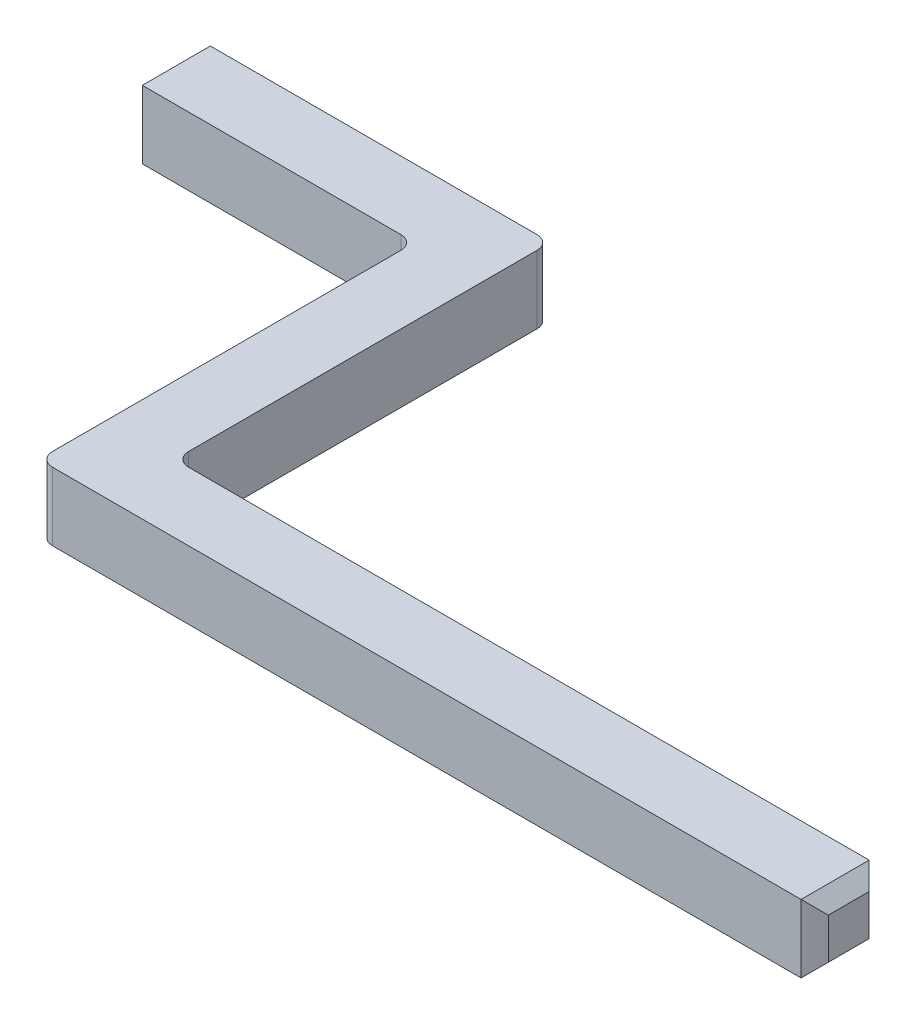
ISO-10303-21;
HEADER;
FILE_DESCRIPTION(('STEP AP214'),'2;1');
FILE_NAME('part.step','',(''),(''),'','','');
FILE_SCHEMA(('AUTOMOTIVE_DESIGN { 1 0 10303 214 1 1 1 1 }'));
ENDSEC;
DATA;
#1=APPLICATION_CONTEXT('core data for automotive mechanical design processes');
#2=APPLICATION_PROTOCOL_DEFINITION('international standard','automotive_design',2000,#1);
#3=PRODUCT_CONTEXT('',#1,'mechanical');
#4=PRODUCT('Part','Part','',(#3));
#5=PRODUCT_RELATED_PRODUCT_CATEGORY('part','',(#4));
#6=PRODUCT_DEFINITION_FORMATION('','',#4);
#7=PRODUCT_DEFINITION_CONTEXT('part definition',#1,'design');
#8=PRODUCT_DEFINITION('design','',#6,#7);
#9=PRODUCT_DEFINITION_SHAPE('','',#8);
#10=(LENGTH_UNIT() NAMED_UNIT(*) SI_UNIT(.MILLI.,.METRE.));
#11=(NAMED_UNIT(*) PLANE_ANGLE_UNIT() SI_UNIT($,.RADIAN.));
#12=(NAMED_UNIT(*) SI_UNIT($,.STERADIAN.) SOLID_ANGLE_UNIT());
#13=UNCERTAINTY_MEASURE_WITH_UNIT(LENGTH_MEASURE(1.E-05),#10,'distance_accuracy_value','');
#14=(GEOMETRIC_REPRESENTATION_CONTEXT(3) GLOBAL_UNCERTAINTY_ASSIGNED_CONTEXT((#13)) GLOBAL_UNIT_ASSIGNED_CONTEXT((#10,
#11,#12)) REPRESENTATION_CONTEXT('',''));
#15=CARTESIAN_POINT('',(0.,0.,0.));
#16=DIRECTION('',(0.,0.,1.));
#17=DIRECTION('',(1.,0.,0.));
#18=AXIS2_PLACEMENT_3D('',#15,#16,#17);
#19=CARTESIAN_POINT('',(-11.131176343569,-0.780745539294026,1.66999948918819));
#20=DIRECTION('',(0.,-1.,0.));
#21=DIRECTION('',(0.,0.,-1.));
#22=AXIS2_PLACEMENT_3D('',#19,#20,#21);
#23=PLANE('',#22);
#24=CARTESIAN_POINT('',(-12.8311756759867,-0.780745539294026,3.19999957084655));
#25=DIRECTION('',(0.,1.,0.));
#26=DIRECTION('',(-1.43052306964333E-05,0.,0.99999999989768));
#27=AXIS2_PLACEMENT_3D('',#24,#25,#26);
#28=CIRCLE('',#27,0.0999999046428003);
#29=CARTESIAN_POINT('',(-12.9311755806295,-0.780745539294026,3.19999957084655));
#30=VERTEX_POINT('',#29);
#31=CARTESIAN_POINT('',(-12.8311771065084,-0.780745539294026,3.29999947547912));
#32=VERTEX_POINT('',#31);
#33=EDGE_CURVE('E11',#30,#32,#28,.T.);
#34=ORIENTED_EDGE('',*,*,#33,.T.);
#35=DIRECTION('',(1.,0.,0.));
#36=VECTOR('',#35,1.);
#37=CARTESIAN_POINT('',(-12.8311771065084,-0.780745539294026,3.29999947547912));
#38=LINE('',#37,#36);
#39=CARTESIAN_POINT('',(-7.33117710650841,-0.780745539294026,3.29999947547912));
#40=VERTEX_POINT('',#39);
#41=EDGE_CURVE('E223',#32,#40,#38,.T.);
#42=ORIENTED_EDGE('',*,*,#41,.T.);
#43=DIRECTION('',(0.,0.,-1.));
#44=VECTOR('',#43,1.);
#45=CARTESIAN_POINT('',(-7.33117710650841,-0.780745539294026,3.29999947547912));
#46=LINE('',#45,#44);
#47=CARTESIAN_POINT('',(-7.33117710650841,-0.780745539294026,2.79999947547912));
#48=VERTEX_POINT('',#47);
#49=EDGE_CURVE('E167',#40,#48,#46,.T.);
#50=ORIENTED_EDGE('',*,*,#49,.T.);
#51=DIRECTION('',(-1.,0.,0.));
#52=VECTOR('',#51,1.);
#53=CARTESIAN_POINT('',(-7.33117710650841,-0.780745539294026,2.79999947547912));
#54=LINE('',#53,#52);
#55=CARTESIAN_POINT('',(-12.3311771065084,-0.780745539294026,2.79999947547912));
#56=VERTEX_POINT('',#55);
#57=EDGE_CURVE('E160',#48,#56,#54,.T.);
#58=ORIENTED_EDGE('',*,*,#57,.T.);
#59=CARTESIAN_POINT('',(-12.3311756759593,-0.780745539294026,2.69999957081912));
#60=DIRECTION('',(0.,-1.,0.));
#61=DIRECTION('',(-1.4305505051084E-05,0.,0.999999999897676));
#62=AXIS2_PLACEMENT_3D('',#59,#60,#61);
#63=CIRCLE('',#62,0.0999999046702354);
#64=CARTESIAN_POINT('',(-12.4311755806295,-0.780745539294026,2.69999957084656));
#65=VERTEX_POINT('',#64);
#66=EDGE_CURVE('E164',#56,#65,#63,.T.);
#67=ORIENTED_EDGE('',*,*,#66,.T.);
#68=DIRECTION('',(-2.74346505433993E-10,0.,-1.));
#69=VECTOR('',#68,1.);
#70=CARTESIAN_POINT('',(-12.4311755806295,-0.780745539294026,2.69999957084656));
#71=LINE('',#70,#69);
#72=CARTESIAN_POINT('',(-12.4311755813318,-0.780745539294026,0.13999945614908));
#73=VERTEX_POINT('',#72);
#74=EDGE_CURVE('E212',#65,#73,#71,.T.);
#75=ORIENTED_EDGE('',*,*,#74,.T.);
#76=CARTESIAN_POINT('',(-12.5311778694479,-0.780745539294026,0.140001791040547));
#77=DIRECTION('',(0.,1.,0.));
#78=DIRECTION('',(0.,0.,-1.));
#79=AXIS2_PLACEMENT_3D('',#76,#77,#78);
#80=CIRCLE('',#79,0.10000228814329);
#81=CARTESIAN_POINT('',(-12.5311778694479,-0.780745539294026,0.0399995028972566));
#82=VERTEX_POINT('',#81);
#83=EDGE_CURVE('E199',#73,#82,#80,.T.);
#84=ORIENTED_EDGE('',*,*,#83,.T.);
#85=DIRECTION('',(-1.,0.,0.));
#86=VECTOR('',#85,1.);
#87=CARTESIAN_POINT('',(-12.5311778694479,-0.780745539294026,0.0399995028972566));
#88=LINE('',#87,#86);
#89=CARTESIAN_POINT('',(-14.9311755806295,-0.780745539294026,0.0399995028972566));
#90=VERTEX_POINT('',#89);
#91=EDGE_CURVE('E269',#82,#90,#88,.T.);
#92=ORIENTED_EDGE('',*,*,#91,.T.);
#93=DIRECTION('',(0.,0.,1.));
#94=VECTOR('',#93,1.);
#95=CARTESIAN_POINT('',(-14.9311755806295,-0.780745539294026,0.0399995028972566));
#96=LINE('',#95,#94);
#97=CARTESIAN_POINT('',(-14.9311755806295,-0.780745539294026,0.539999485015865));
#98=VERTEX_POINT('',#97);
#99=EDGE_CURVE('E244',#90,#98,#96,.T.);
#100=ORIENTED_EDGE('',*,*,#99,.T.);
#101=DIRECTION('',(1.,0.,0.));
#102=VECTOR('',#101,1.);
#103=CARTESIAN_POINT('',(-14.9311755806295,-0.780745539294026,0.539999485015865));
#104=LINE('',#103,#102);
#105=CARTESIAN_POINT('',(-13.0311778694479,-0.780745539294026,0.539999485015865));
#106=VERTEX_POINT('',#105);
#107=EDGE_CURVE('E273',#98,#106,#104,.T.);
#108=ORIENTED_EDGE('',*,*,#107,.T.);
#109=CARTESIAN_POINT('',(-13.0311778694479,-0.780745539294026,0.640001773859875));
#110=DIRECTION('',(0.,-1.,0.));
#111=DIRECTION('',(0.,0.,-1.));
#112=AXIS2_PLACEMENT_3D('',#109,#110,#111);
#113=CIRCLE('',#112,0.10000228884401);
#114=CARTESIAN_POINT('',(-12.9311755806295,-0.780745539294026,0.639999508857725));
#115=VERTEX_POINT('',#114);
#116=EDGE_CURVE('E310',#106,#115,#113,.T.);
#117=ORIENTED_EDGE('',*,*,#116,.T.);
#118=DIRECTION('',(0.,0.,1.));
#119=VECTOR('',#118,1.);
#120=CARTESIAN_POINT('',(-12.9311755806295,-0.780745539294026,0.639999508857725));
#121=LINE('',#120,#119);
#122=EDGE_CURVE('E363',#115,#30,#121,.T.);
#123=ORIENTED_EDGE('',*,*,#122,.T.);
#124=EDGE_LOOP('',(#34,#42,#50,#58,#67,#75,#84,#92,#100,#108,#117,#123));
#125=FACE_BOUND('',#124,.T.);
#126=ADVANCED_FACE('F17',(#125),#23,.F.);
#127=CARTESIAN_POINT('',(-11.131176343569,-1.28074553929403,1.66999948918819));
#128=DIRECTION('',(0.,-1.,0.));
#129=DIRECTION('',(0.,0.,-1.));
#130=AXIS2_PLACEMENT_3D('',#127,#128,#129);
#131=PLANE('',#130);
#132=CARTESIAN_POINT('',(-12.8311756759867,-1.28074553929403,3.19999957084655));
#133=DIRECTION('',(0.,-1.,0.));
#134=DIRECTION('',(-1.43052306964333E-05,0.,0.99999999989768));
#135=AXIS2_PLACEMENT_3D('',#132,#133,#134);
#136=CIRCLE('',#135,0.0999999046428003);
#137=CARTESIAN_POINT('',(-12.8311771065084,-1.28074553929403,3.29999947547912));
#138=VERTEX_POINT('',#137);
#139=CARTESIAN_POINT('',(-12.9311755806295,-1.28074553929403,3.19999957084655));
#140=VERTEX_POINT('',#139);
#141=EDGE_CURVE('E28',#138,#140,#136,.T.);
#142=ORIENTED_EDGE('',*,*,#141,.T.);
#143=DIRECTION('',(0.,0.,1.));
#144=VECTOR('',#143,1.);
#145=CARTESIAN_POINT('',(-12.9311755806295,-1.28074553929403,0.639999508857725));
#146=LINE('',#145,#144);
#147=CARTESIAN_POINT('',(-12.9311755806295,-1.28074553929403,0.639999508857725));
#148=VERTEX_POINT('',#147);
#149=EDGE_CURVE('E227',#148,#140,#146,.T.);
#150=ORIENTED_EDGE('',*,*,#149,.F.);
#151=CARTESIAN_POINT('',(-13.0311778694479,-1.28074553929403,0.640001773859875));
#152=DIRECTION('',(0.,-1.,0.));
#153=DIRECTION('',(0.,0.,-1.));
#154=AXIS2_PLACEMENT_3D('',#151,#152,#153);
#155=CIRCLE('',#154,0.10000228884401);
#156=CARTESIAN_POINT('',(-13.0311778694479,-1.28074553929403,0.539999485015865));
#157=VERTEX_POINT('',#156);
#158=EDGE_CURVE('E313',#157,#148,#155,.T.);
#159=ORIENTED_EDGE('',*,*,#158,.F.);
#160=DIRECTION('',(1.,0.,0.));
#161=VECTOR('',#160,1.);
#162=CARTESIAN_POINT('',(-14.9311755806295,-1.28074553929403,0.539999485015865));
#163=LINE('',#162,#161);
#164=CARTESIAN_POINT('',(-14.9311755806295,-1.28074553929403,0.539999485015865));
#165=VERTEX_POINT('',#164);
#166=EDGE_CURVE('E276',#165,#157,#163,.T.);
#167=ORIENTED_EDGE('',*,*,#166,.F.);
#168=DIRECTION('',(0.,0.,1.));
#169=VECTOR('',#168,1.);
#170=CARTESIAN_POINT('',(-14.9311755806295,-1.28074553929403,0.0399995028972566));
#171=LINE('',#170,#169);
#172=CARTESIAN_POINT('',(-14.9311755806295,-1.28074553929403,0.0399995028972566));
#173=VERTEX_POINT('',#172);
#174=EDGE_CURVE('E248',#173,#165,#171,.T.);
#175=ORIENTED_EDGE('',*,*,#174,.F.);
#176=DIRECTION('',(-1.,0.,0.));
#177=VECTOR('',#176,1.);
#178=CARTESIAN_POINT('',(-12.5311778694479,-1.28074553929403,0.0399995028972566));
#179=LINE('',#178,#177);
#180=CARTESIAN_POINT('',(-12.5311778694479,-1.28074553929403,0.0399995028972566));
#181=VERTEX_POINT('',#180);
#182=EDGE_CURVE('E272',#181,#173,#179,.T.);
#183=ORIENTED_EDGE('',*,*,#182,.F.);
#184=CARTESIAN_POINT('',(-12.5311778694479,-1.28074553929403,0.140001791040547));
#185=DIRECTION('',(0.,-1.,0.));
#186=DIRECTION('',(0.,0.,-1.));
#187=AXIS2_PLACEMENT_3D('',#184,#185,#186);
#188=CIRCLE('',#187,0.10000228814329);
#189=CARTESIAN_POINT('',(-12.4311755813318,-1.28074553929403,0.13999945614908));
#190=VERTEX_POINT('',#189);
#191=EDGE_CURVE('E196',#181,#190,#188,.T.);
#192=ORIENTED_EDGE('',*,*,#191,.T.);
#193=DIRECTION('',(-2.74346505433993E-10,0.,-1.));
#194=VECTOR('',#193,1.);
#195=CARTESIAN_POINT('',(-12.4311755806295,-1.28074553929403,2.69999957084656));
#196=LINE('',#195,#194);
#197=CARTESIAN_POINT('',(-12.4311755806295,-1.28074553929403,2.69999957084656));
#198=VERTEX_POINT('',#197);
#199=EDGE_CURVE('E215',#198,#190,#196,.T.);
#200=ORIENTED_EDGE('',*,*,#199,.F.);
#201=CARTESIAN_POINT('',(-12.3311756759593,-1.28074553929403,2.69999957081912));
#202=DIRECTION('',(0.,-1.,0.));
#203=DIRECTION('',(-1.4305505051084E-05,0.,0.999999999897676));
#204=AXIS2_PLACEMENT_3D('',#201,#202,#203);
#205=CIRCLE('',#204,0.0999999046702354);
#206=CARTESIAN_POINT('',(-12.3311771065084,-1.28074553929403,2.79999947547912));
#207=VERTEX_POINT('',#206);
#208=EDGE_CURVE('E185',#207,#198,#205,.T.);
#209=ORIENTED_EDGE('',*,*,#208,.F.);
#210=DIRECTION('',(-1.,0.,0.));
#211=VECTOR('',#210,1.);
#212=CARTESIAN_POINT('',(-7.33117710650841,-1.28074553929403,2.79999947547912));
#213=LINE('',#212,#211);
#214=CARTESIAN_POINT('',(-7.33117710650841,-1.28074553929403,2.79999947547912));
#215=VERTEX_POINT('',#214);
#216=EDGE_CURVE('E174',#215,#207,#213,.T.);
#217=ORIENTED_EDGE('',*,*,#216,.F.);
#218=DIRECTION('',(0.,0.,-1.));
#219=VECTOR('',#218,1.);
#220=CARTESIAN_POINT('',(-7.33117710650841,-1.28074553929403,3.29999947547912));
#221=LINE('',#220,#219);
#222=CARTESIAN_POINT('',(-7.33117710650841,-1.28074553929403,3.29999947547912));
#223=VERTEX_POINT('',#222);
#224=EDGE_CURVE('E211',#223,#215,#221,.T.);
#225=ORIENTED_EDGE('',*,*,#224,.F.);
#226=DIRECTION('',(1.,0.,0.));
#227=VECTOR('',#226,1.);
#228=CARTESIAN_POINT('',(-12.8311771065084,-1.28074553929403,3.29999947547912));
#229=LINE('',#228,#227);
#230=EDGE_CURVE('E173',#138,#223,#229,.T.);
#231=ORIENTED_EDGE('',*,*,#230,.F.);
#232=EDGE_LOOP('',(#142,#150,#159,#167,#175,#183,#192,#200,#209,#217,#225,#231));
#233=FACE_BOUND('',#232,.T.);
#234=ADVANCED_FACE('F419',(#233),#131,.T.);
#235=CARTESIAN_POINT('',(-12.8311756759867,-1.28074553929403,3.19999957084655));
#236=DIRECTION('',(0.,1.,0.));
#237=DIRECTION('',(-1.43052306964333E-05,0.,0.99999999989768));
#238=AXIS2_PLACEMENT_3D('',#235,#236,#237);
#239=CYLINDRICAL_SURFACE('',#238,0.0999999046428003);
#240=ORIENTED_EDGE('',*,*,#141,.F.);
#241=DIRECTION('',(0.,1.,0.));
#242=VECTOR('',#241,1.);
#243=CARTESIAN_POINT('',(-12.8311771065084,-1.28074553929403,3.29999947547912));
#244=LINE('',#243,#242);
#245=EDGE_CURVE('E226',#138,#32,#244,.T.);
#246=ORIENTED_EDGE('',*,*,#245,.T.);
#247=ORIENTED_EDGE('',*,*,#33,.F.);
#248=DIRECTION('',(0.,1.,0.));
#249=VECTOR('',#248,1.);
#250=CARTESIAN_POINT('',(-12.9311755806295,-1.28074553929403,3.19999957084655));
#251=LINE('',#250,#249);
#252=EDGE_CURVE('E194',#140,#30,#251,.T.);
#253=ORIENTED_EDGE('',*,*,#252,.F.);
#254=EDGE_LOOP('',(#240,#246,#247,#253));
#255=FACE_BOUND('',#254,.T.);
#256=ADVANCED_FACE('F331',(#255),#239,.T.);
#257=CARTESIAN_POINT('',(-12.8311771065084,-1.28074553929403,3.29999947547912));
#258=DIRECTION('',(0.,0.,1.));
#259=DIRECTION('',(1.,0.,0.));
#260=AXIS2_PLACEMENT_3D('',#257,#258,#259);
#261=PLANE('',#260);
#262=ORIENTED_EDGE('',*,*,#230,.T.);
#263=DIRECTION('',(0.,1.,0.));
#264=VECTOR('',#263,1.);
#265=CARTESIAN_POINT('',(-7.33117710650841,-1.28074553929403,3.29999947547912));
#266=LINE('',#265,#264);
#267=EDGE_CURVE('E210',#223,#40,#266,.T.);
#268=ORIENTED_EDGE('',*,*,#267,.T.);
#269=ORIENTED_EDGE('',*,*,#41,.F.);
#270=ORIENTED_EDGE('',*,*,#245,.F.);
#271=EDGE_LOOP('',(#262,#268,#269,#270));
#272=FACE_BOUND('',#271,.T.);
#273=ADVANCED_FACE('F335',(#272),#261,.T.);
#274=CARTESIAN_POINT('',(-7.33117710650841,-1.28074553929403,2.79999947547912));
#275=DIRECTION('',(0.,0.,-1.));
#276=DIRECTION('',(0.,-1.,0.));
#277=AXIS2_PLACEMENT_3D('',#274,#275,#276);
#278=PLANE('',#277);
#279=ORIENTED_EDGE('',*,*,#216,.T.);
#280=DIRECTION('',(0.,1.,0.));
#281=VECTOR('',#280,1.);
#282=CARTESIAN_POINT('',(-12.3311771065084,-1.28074553929403,2.79999947547912));
#283=LINE('',#282,#281);
#284=EDGE_CURVE('E21',#207,#56,#283,.T.);
#285=ORIENTED_EDGE('',*,*,#284,.T.);
#286=ORIENTED_EDGE('',*,*,#57,.F.);
#287=DIRECTION('',(0.,1.,0.));
#288=VECTOR('',#287,1.);
#289=CARTESIAN_POINT('',(-7.33117710650841,-1.28074553929403,2.79999947547912));
#290=LINE('',#289,#288);
#291=EDGE_CURVE('E216',#215,#48,#290,.T.);
#292=ORIENTED_EDGE('',*,*,#291,.F.);
#293=EDGE_LOOP('',(#279,#285,#286,#292));
#294=FACE_BOUND('',#293,.T.);
#295=ADVANCED_FACE('F19',(#294),#278,.T.);
#296=CARTESIAN_POINT('',(-12.3311756759593,-1.28074553929403,2.69999957081912));
#297=DIRECTION('',(0.,1.,0.));
#298=DIRECTION('',(-1.4305505051084E-05,0.,0.999999999897676));
#299=AXIS2_PLACEMENT_3D('',#296,#297,#298);
#300=CYLINDRICAL_SURFACE('',#299,0.0999999046702354);
#301=ORIENTED_EDGE('',*,*,#208,.T.);
#302=DIRECTION('',(0.,1.,0.));
#303=VECTOR('',#302,1.);
#304=CARTESIAN_POINT('',(-12.4311755806295,-1.28074553929403,2.69999957084656));
#305=LINE('',#304,#303);
#306=EDGE_CURVE('E182',#198,#65,#305,.T.);
#307=ORIENTED_EDGE('',*,*,#306,.T.);
#308=ORIENTED_EDGE('',*,*,#66,.F.);
#309=ORIENTED_EDGE('',*,*,#284,.F.);
#310=EDGE_LOOP('',(#301,#307,#308,#309));
#311=FACE_BOUND('',#310,.T.);
#312=ADVANCED_FACE('F180',(#311),#300,.F.);
#313=CARTESIAN_POINT('',(-12.4311755806295,-1.28074553929403,2.69999957084656));
#314=DIRECTION('',(1.,0.,-2.74346505433993E-10));
#315=DIRECTION('',(0.,-1.,0.));
#316=AXIS2_PLACEMENT_3D('',#313,#314,#315);
#317=PLANE('',#316);
#318=ORIENTED_EDGE('',*,*,#199,.T.);
#319=DIRECTION('',(0.,1.,0.));
#320=VECTOR('',#319,1.);
#321=CARTESIAN_POINT('',(-12.4311755813318,-1.28074553929403,0.13999945614908));
#322=LINE('',#321,#320);
#323=EDGE_CURVE('E247',#190,#73,#322,.T.);
#324=ORIENTED_EDGE('',*,*,#323,.T.);
#325=ORIENTED_EDGE('',*,*,#74,.F.);
#326=ORIENTED_EDGE('',*,*,#306,.F.);
#327=EDGE_LOOP('',(#318,#324,#325,#326));
#328=FACE_BOUND('',#327,.T.);
#329=ADVANCED_FACE('F372',(#328),#317,.T.);
#330=CARTESIAN_POINT('',(-12.5311778694479,-1.28074553929403,0.140001791040547));
#331=DIRECTION('',(0.,1.,0.));
#332=DIRECTION('',(0.,0.,-1.));
#333=AXIS2_PLACEMENT_3D('',#330,#331,#332);
#334=CYLINDRICAL_SURFACE('',#333,0.10000228814329);
#335=ORIENTED_EDGE('',*,*,#191,.F.);
#336=DIRECTION('',(0.,1.,0.));
#337=VECTOR('',#336,1.);
#338=CARTESIAN_POINT('',(-12.5311778694479,-1.28074553929403,0.0399995028972566));
#339=LINE('',#338,#337);
#340=EDGE_CURVE('E200',#181,#82,#339,.T.);
#341=ORIENTED_EDGE('',*,*,#340,.T.);
#342=ORIENTED_EDGE('',*,*,#83,.F.);
#343=ORIENTED_EDGE('',*,*,#323,.F.);
#344=EDGE_LOOP('',(#335,#341,#342,#343));
#345=FACE_BOUND('',#344,.T.);
#346=ADVANCED_FACE('F376',(#345),#334,.T.);
#347=CARTESIAN_POINT('',(-12.5311778694479,-1.28074553929403,0.0399995028972566));
#348=DIRECTION('',(0.,0.,-1.));
#349=DIRECTION('',(0.,-1.,0.));
#350=AXIS2_PLACEMENT_3D('',#347,#348,#349);
#351=PLANE('',#350);
#352=ORIENTED_EDGE('',*,*,#182,.T.);
#353=DIRECTION('',(0.,1.,0.));
#354=VECTOR('',#353,1.);
#355=CARTESIAN_POINT('',(-14.9311755806295,-1.28074553929403,0.0399995028972566));
#356=LINE('',#355,#354);
#357=EDGE_CURVE('E255',#173,#90,#356,.T.);
#358=ORIENTED_EDGE('',*,*,#357,.T.);
#359=ORIENTED_EDGE('',*,*,#91,.F.);
#360=ORIENTED_EDGE('',*,*,#340,.F.);
#361=EDGE_LOOP('',(#352,#358,#359,#360));
#362=FACE_BOUND('',#361,.T.);
#363=ADVANCED_FACE('F385',(#362),#351,.T.);
#364=CARTESIAN_POINT('',(-14.9311755806295,-1.28074553929403,0.539999485015865));
#365=DIRECTION('',(0.,0.,1.));
#366=DIRECTION('',(1.,0.,0.));
#367=AXIS2_PLACEMENT_3D('',#364,#365,#366);
#368=PLANE('',#367);
#369=ORIENTED_EDGE('',*,*,#166,.T.);
#370=DIRECTION('',(0.,1.,0.));
#371=VECTOR('',#370,1.);
#372=CARTESIAN_POINT('',(-13.0311778694479,-1.28074553929403,0.539999485015865));
#373=LINE('',#372,#371);
#374=EDGE_CURVE('E305',#157,#106,#373,.T.);
#375=ORIENTED_EDGE('',*,*,#374,.T.);
#376=ORIENTED_EDGE('',*,*,#107,.F.);
#377=DIRECTION('',(0.,1.,0.));
#378=VECTOR('',#377,1.);
#379=CARTESIAN_POINT('',(-14.9311755806295,-1.28074553929403,0.539999485015865));
#380=LINE('',#379,#378);
#381=EDGE_CURVE('E236',#165,#98,#380,.T.);
#382=ORIENTED_EDGE('',*,*,#381,.F.);
#383=EDGE_LOOP('',(#369,#375,#376,#382));
#384=FACE_BOUND('',#383,.T.);
#385=ADVANCED_FACE('F435',(#384),#368,.T.);
#386=CARTESIAN_POINT('',(-13.0311778694479,-1.28074553929403,0.640001773859875));
#387=DIRECTION('',(0.,1.,0.));
#388=DIRECTION('',(0.,0.,-1.));
#389=AXIS2_PLACEMENT_3D('',#386,#387,#388);
#390=CYLINDRICAL_SURFACE('',#389,0.10000228884401);
#391=ORIENTED_EDGE('',*,*,#158,.T.);
#392=DIRECTION('',(0.,1.,0.));
#393=VECTOR('',#392,1.);
#394=CARTESIAN_POINT('',(-12.9311755806295,-1.28074553929403,0.639999508857725));
#395=LINE('',#394,#393);
#396=EDGE_CURVE('E365',#148,#115,#395,.T.);
#397=ORIENTED_EDGE('',*,*,#396,.T.);
#398=ORIENTED_EDGE('',*,*,#116,.F.);
#399=ORIENTED_EDGE('',*,*,#374,.F.);
#400=EDGE_LOOP('',(#391,#397,#398,#399));
#401=FACE_BOUND('',#400,.T.);
#402=ADVANCED_FACE('F414',(#401),#390,.F.);
#403=CARTESIAN_POINT('',(-12.9311755806295,-1.28074553929403,0.639999508857725));
#404=DIRECTION('',(-1.,0.,0.));
#405=DIRECTION('',(0.,0.,1.));
#406=AXIS2_PLACEMENT_3D('',#403,#404,#405);
#407=PLANE('',#406);
#408=ORIENTED_EDGE('',*,*,#149,.T.);
#409=ORIENTED_EDGE('',*,*,#252,.T.);
#410=ORIENTED_EDGE('',*,*,#122,.F.);
#411=ORIENTED_EDGE('',*,*,#396,.F.);
#412=EDGE_LOOP('',(#408,#409,#410,#411));
#413=FACE_BOUND('',#412,.T.);
#414=ADVANCED_FACE('F417',(#413),#407,.T.);
#415=CARTESIAN_POINT('',(-7.23117710650841,-1.03074553929403,3.04999947547912));
#416=DIRECTION('',(1.,0.,0.));
#417=DIRECTION('',(0.,1.,0.));
#418=AXIS2_PLACEMENT_3D('',#415,#416,#417);
#419=PLANE('',#418);
#420=DIRECTION('',(0.,0.,-1.));
#421=VECTOR('',#420,1.);
#422=CARTESIAN_POINT('',(-7.23117710650841,-0.880745539294026,2.79999947547912));
#423=LINE('',#422,#421);
#424=CARTESIAN_POINT('',(-7.23117710650841,-0.880745539294027,3.19999947547912));
#425=VERTEX_POINT('',#424);
#426=CARTESIAN_POINT('',(-7.23117710650841,-0.880745539294026,2.89999947547912));
#427=VERTEX_POINT('',#426);
#428=EDGE_CURVE('E264',#425,#427,#423,.T.);
#429=ORIENTED_EDGE('',*,*,#428,.F.);
#430=DIRECTION('',(0.,1.,0.));
#431=VECTOR('',#430,1.);
#432=CARTESIAN_POINT('',(-7.23117710650841,-0.780745539294026,3.19999947547912));
#433=LINE('',#432,#431);
#434=CARTESIAN_POINT('',(-7.23117710650841,-1.18074553929403,3.19999947547912));
#435=VERTEX_POINT('',#434);
#436=EDGE_CURVE('E207',#435,#425,#433,.T.);
#437=ORIENTED_EDGE('',*,*,#436,.F.);
#438=DIRECTION('',(0.,0.,1.));
#439=VECTOR('',#438,1.);
#440=CARTESIAN_POINT('',(-7.23117710650841,-1.18074553929403,3.29999947547912));
#441=LINE('',#440,#439);
#442=CARTESIAN_POINT('',(-7.23117710650841,-1.18074553929403,2.89999947547912));
#443=VERTEX_POINT('',#442);
#444=EDGE_CURVE('E219',#443,#435,#441,.T.);
#445=ORIENTED_EDGE('',*,*,#444,.F.);
#446=DIRECTION('',(0.,-1.,0.));
#447=VECTOR('',#446,1.);
#448=CARTESIAN_POINT('',(-7.23117710650841,-1.28074553929403,2.89999947547912));
#449=LINE('',#448,#447);
#450=EDGE_CURVE('E240',#427,#443,#449,.T.);
#451=ORIENTED_EDGE('',*,*,#450,.F.);
#452=EDGE_LOOP('',(#429,#437,#445,#451));
#453=FACE_BOUND('',#452,.T.);
#454=ADVANCED_FACE('F441',(#453),#419,.T.);
#455=CARTESIAN_POINT('',(-7.33117710650841,-1.28074553929403,3.29999947547912));
#456=DIRECTION('',(0.707106781186548,0.,0.707106781186548));
#457=DIRECTION('',(0.,-1.,0.));
#458=AXIS2_PLACEMENT_3D('',#455,#456,#457);
#459=PLANE('',#458);
#460=ORIENTED_EDGE('',*,*,#436,.T.);
#461=DIRECTION('',(0.577350269189626,-0.577350269189626,-0.577350269189626));
#462=VECTOR('',#461,1.);
#463=CARTESIAN_POINT('',(-7.24784377317508,-0.864078872627359,3.21666614214579));
#464=LINE('',#463,#462);
#465=EDGE_CURVE('E265',#40,#425,#464,.T.);
#466=ORIENTED_EDGE('',*,*,#465,.F.);
#467=ORIENTED_EDGE('',*,*,#267,.F.);
#468=DIRECTION('',(0.577350269189626,0.577350269189626,-0.577350269189626));
#469=VECTOR('',#468,1.);
#470=CARTESIAN_POINT('',(-7.24784377317508,-1.19741220596069,3.21666614214579));
#471=LINE('',#470,#469);
#472=EDGE_CURVE('E284',#223,#435,#471,.T.);
#473=ORIENTED_EDGE('',*,*,#472,.T.);
#474=EDGE_LOOP('',(#460,#466,#467,#473));
#475=FACE_BOUND('',#474,.T.);
#476=ADVANCED_FACE('F340',(#475),#459,.T.);
#477=CARTESIAN_POINT('',(-7.33117710650841,-1.28074553929403,2.79999947547912));
#478=DIRECTION('',(0.707106781186548,-0.707106781186548,0.));
#479=DIRECTION('',(0.,0.,-1.));
#480=AXIS2_PLACEMENT_3D('',#477,#478,#479);
#481=PLANE('',#480);
#482=ORIENTED_EDGE('',*,*,#444,.T.);
#483=ORIENTED_EDGE('',*,*,#472,.F.);
#484=ORIENTED_EDGE('',*,*,#224,.T.);
#485=DIRECTION('',(0.577350269189626,0.577350269189626,0.577350269189626));
#486=VECTOR('',#485,1.);
#487=CARTESIAN_POINT('',(-7.24784377317508,-1.19741220596069,2.88333280881246));
#488=LINE('',#487,#486);
#489=EDGE_CURVE('E220',#215,#443,#488,.T.);
#490=ORIENTED_EDGE('',*,*,#489,.T.);
#491=EDGE_LOOP('',(#482,#483,#484,#490));
#492=FACE_BOUND('',#491,.T.);
#493=ADVANCED_FACE('F351',(#492),#481,.T.);
#494=CARTESIAN_POINT('',(-7.33117710650841,-0.780745539294026,2.79999947547912));
#495=DIRECTION('',(0.707106781186548,0.,-0.707106781186548));
#496=DIRECTION('',(0.,-1.,0.));
#497=AXIS2_PLACEMENT_3D('',#494,#495,#496);
#498=PLANE('',#497);
#499=ORIENTED_EDGE('',*,*,#450,.T.);
#500=ORIENTED_EDGE('',*,*,#489,.F.);
#501=ORIENTED_EDGE('',*,*,#291,.T.);
#502=DIRECTION('',(0.577350269189626,-0.577350269189626,0.577350269189626));
#503=VECTOR('',#502,1.);
#504=CARTESIAN_POINT('',(-7.24784377317508,-0.864078872627359,2.88333280881246));
#505=LINE('',#504,#503);
#506=EDGE_CURVE('E260',#48,#427,#505,.T.);
#507=ORIENTED_EDGE('',*,*,#506,.T.);
#508=EDGE_LOOP('',(#499,#500,#501,#507));
#509=FACE_BOUND('',#508,.T.);
#510=ADVANCED_FACE('F347',(#509),#498,.T.);
#511=CARTESIAN_POINT('',(-7.33117710650841,-0.780745539294026,3.29999947547912));
#512=DIRECTION('',(0.707106781186548,0.707106781186548,0.));
#513=DIRECTION('',(0.,0.,-1.));
#514=AXIS2_PLACEMENT_3D('',#511,#512,#513);
#515=PLANE('',#514);
#516=ORIENTED_EDGE('',*,*,#428,.T.);
#517=ORIENTED_EDGE('',*,*,#506,.F.);
#518=ORIENTED_EDGE('',*,*,#49,.F.);
#519=ORIENTED_EDGE('',*,*,#465,.T.);
#520=EDGE_LOOP('',(#516,#517,#518,#519));
#521=FACE_BOUND('',#520,.T.);
#522=ADVANCED_FACE('F344',(#521),#515,.T.);
#523=CARTESIAN_POINT('',(-15.0311755806295,-1.03074553929403,0.289999493956561));
#524=DIRECTION('',(-1.,0.,0.));
#525=DIRECTION('',(0.,0.,1.));
#526=AXIS2_PLACEMENT_3D('',#523,#524,#525);
#527=PLANE('',#526);
#528=DIRECTION('',(0.,0.,1.));
#529=VECTOR('',#528,1.);
#530=CARTESIAN_POINT('',(-15.0311755806295,-0.880745539294026,0.539999485015865));
#531=LINE('',#530,#529);
#532=CARTESIAN_POINT('',(-15.0311755806295,-0.880745539294027,0.139999502897257));
#533=VERTEX_POINT('',#532);
#534=CARTESIAN_POINT('',(-15.0311755806295,-0.880745539294025,0.439999485015865));
#535=VERTEX_POINT('',#534);
#536=EDGE_CURVE('E317',#533,#535,#531,.T.);
#537=ORIENTED_EDGE('',*,*,#536,.F.);
#538=DIRECTION('',(0.,1.,0.));
#539=VECTOR('',#538,1.);
#540=CARTESIAN_POINT('',(-15.0311755806295,-0.780745539294026,0.139999502897257));
#541=LINE('',#540,#539);
#542=CARTESIAN_POINT('',(-15.0311755806295,-1.18074553929403,0.139999502897257));
#543=VERTEX_POINT('',#542);
#544=EDGE_CURVE('E252',#543,#533,#541,.T.);
#545=ORIENTED_EDGE('',*,*,#544,.F.);
#546=DIRECTION('',(0.,0.,-1.));
#547=VECTOR('',#546,1.);
#548=CARTESIAN_POINT('',(-15.0311755806295,-1.18074553929403,0.0399995028972566));
#549=LINE('',#548,#547);
#550=CARTESIAN_POINT('',(-15.0311755806295,-1.18074553929403,0.439999485015865));
#551=VERTEX_POINT('',#550);
#552=EDGE_CURVE('E231',#551,#543,#549,.T.);
#553=ORIENTED_EDGE('',*,*,#552,.F.);
#554=DIRECTION('',(0.,-1.,0.));
#555=VECTOR('',#554,1.);
#556=CARTESIAN_POINT('',(-15.0311755806295,-1.28074553929403,0.439999485015865));
#557=LINE('',#556,#555);
#558=EDGE_CURVE('E201',#535,#551,#557,.T.);
#559=ORIENTED_EDGE('',*,*,#558,.F.);
#560=EDGE_LOOP('',(#537,#545,#553,#559));
#561=FACE_BOUND('',#560,.T.);
#562=ADVANCED_FACE('F454',(#561),#527,.T.);
#563=CARTESIAN_POINT('',(-14.9311755806295,-1.28074553929403,0.0399995028972566));
#564=DIRECTION('',(-0.707106781186547,0.,-0.707106781186548));
#565=DIRECTION('',(-0.707106781186548,0.,0.707106781186547));
#566=AXIS2_PLACEMENT_3D('',#563,#564,#565);
#567=PLANE('',#566);
#568=ORIENTED_EDGE('',*,*,#544,.T.);
#569=DIRECTION('',(-0.577350269189626,-0.577350269189626,0.577350269189626));
#570=VECTOR('',#569,1.);
#571=CARTESIAN_POINT('',(-15.0145089139628,-0.864078872627359,0.12333283623059));
#572=LINE('',#571,#570);
#573=EDGE_CURVE('E206',#90,#533,#572,.T.);
#574=ORIENTED_EDGE('',*,*,#573,.F.);
#575=ORIENTED_EDGE('',*,*,#357,.F.);
#576=DIRECTION('',(-0.577350269189626,0.577350269189626,0.577350269189626));
#577=VECTOR('',#576,1.);
#578=CARTESIAN_POINT('',(-15.0145089109826,-1.19741220894093,0.123332833250358));
#579=LINE('',#578,#577);
#580=EDGE_CURVE('E235',#173,#543,#579,.T.);
#581=ORIENTED_EDGE('',*,*,#580,.T.);
#582=EDGE_LOOP('',(#568,#574,#575,#581));
#583=FACE_BOUND('',#582,.T.);
#584=ADVANCED_FACE('F389',(#583),#567,.T.);
#585=CARTESIAN_POINT('',(-14.9311755806295,-1.28074553929403,0.539999485015865));
#586=DIRECTION('',(-0.707106781186548,-0.707106781186548,0.));
#587=DIRECTION('',(-0.707106781186548,0.707106781186548,0.));
#588=AXIS2_PLACEMENT_3D('',#585,#586,#587);
#589=PLANE('',#588);
#590=ORIENTED_EDGE('',*,*,#552,.T.);
#591=ORIENTED_EDGE('',*,*,#580,.F.);
#592=ORIENTED_EDGE('',*,*,#174,.T.);
#593=DIRECTION('',(-0.577350269189626,0.577350269189626,-0.577350269189626));
#594=VECTOR('',#593,1.);
#595=CARTESIAN_POINT('',(-15.0145089139628,-1.19741220596069,0.456666151682532));
#596=LINE('',#595,#594);
#597=EDGE_CURVE('E205',#165,#551,#596,.T.);
#598=ORIENTED_EDGE('',*,*,#597,.T.);
#599=EDGE_LOOP('',(#590,#591,#592,#598));
#600=FACE_BOUND('',#599,.T.);
#601=ADVANCED_FACE('F444',(#600),#589,.T.);
#602=CARTESIAN_POINT('',(-14.9311755806295,-0.780745539294026,0.539999485015865));
#603=DIRECTION('',(-0.707106781186548,0.,0.707106781186548));
#604=DIRECTION('',(0.,1.,0.));
#605=AXIS2_PLACEMENT_3D('',#602,#603,#604);
#606=PLANE('',#605);
#607=ORIENTED_EDGE('',*,*,#558,.T.);
#608=ORIENTED_EDGE('',*,*,#597,.F.);
#609=ORIENTED_EDGE('',*,*,#381,.T.);
#610=DIRECTION('',(-0.577350269189626,-0.577350269189626,-0.577350269189626));
#611=VECTOR('',#610,1.);
#612=CARTESIAN_POINT('',(-15.0145089109826,-0.864078869647127,0.456666154662763));
#613=LINE('',#612,#611);
#614=EDGE_CURVE('E321',#98,#535,#613,.T.);
#615=ORIENTED_EDGE('',*,*,#614,.T.);
#616=EDGE_LOOP('',(#607,#608,#609,#615));
#617=FACE_BOUND('',#616,.T.);
#618=ADVANCED_FACE('F447',(#617),#606,.T.);
#619=CARTESIAN_POINT('',(-14.9311755806295,-0.780745539294026,0.0399995028972566));
#620=DIRECTION('',(-0.707106781186548,0.707106781186548,0.));
#621=DIRECTION('',(0.,0.,1.));
#622=AXIS2_PLACEMENT_3D('',#619,#620,#621);
#623=PLANE('',#622);
#624=ORIENTED_EDGE('',*,*,#536,.T.);
#625=ORIENTED_EDGE('',*,*,#614,.F.);
#626=ORIENTED_EDGE('',*,*,#99,.F.);
#627=ORIENTED_EDGE('',*,*,#573,.T.);
#628=EDGE_LOOP('',(#624,#625,#626,#627));
#629=FACE_BOUND('',#628,.T.);
#630=ADVANCED_FACE('F392',(#629),#623,.T.);
#631=CLOSED_SHELL('',(#126,#234,#256,#273,#295,#312,#329,#346,#363,#385,#402,#414,#454,#476,
#493,#510,#522,#562,#584,#601,#618,#630));
#632=MANIFOLD_SOLID_BREP('B1',#631);
#633=ADVANCED_BREP_SHAPE_REPRESENTATION('',(#18,#632),#14);
#634=SHAPE_DEFINITION_REPRESENTATION(#9,#633);
ENDSEC;
END-ISO-10303-21;
